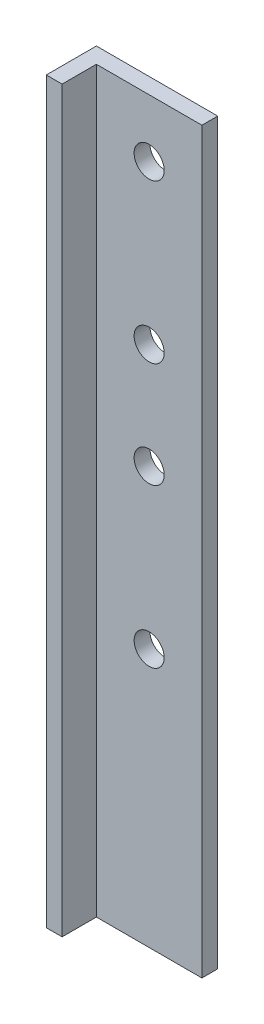
ISO-10303-21;
HEADER;
FILE_DESCRIPTION(('STEP AP214'),'2;1');
FILE_NAME('part.step','',(''),(''),'','','');
FILE_SCHEMA(('AUTOMOTIVE_DESIGN { 1 0 10303 214 1 1 1 1 }'));
ENDSEC;
DATA;
#1=APPLICATION_CONTEXT('core data for automotive mechanical design processes');
#2=APPLICATION_PROTOCOL_DEFINITION('international standard','automotive_design',2000,#1);
#3=PRODUCT_CONTEXT('',#1,'mechanical');
#4=PRODUCT('Part','Part','',(#3));
#5=PRODUCT_RELATED_PRODUCT_CATEGORY('part','',(#4));
#6=PRODUCT_DEFINITION_FORMATION('','',#4);
#7=PRODUCT_DEFINITION_CONTEXT('part definition',#1,'design');
#8=PRODUCT_DEFINITION('design','',#6,#7);
#9=PRODUCT_DEFINITION_SHAPE('','',#8);
#10=(LENGTH_UNIT() NAMED_UNIT(*) SI_UNIT(.MILLI.,.METRE.));
#11=(NAMED_UNIT(*) PLANE_ANGLE_UNIT() SI_UNIT($,.RADIAN.));
#12=(NAMED_UNIT(*) SI_UNIT($,.STERADIAN.) SOLID_ANGLE_UNIT());
#13=UNCERTAINTY_MEASURE_WITH_UNIT(LENGTH_MEASURE(1.E-05),#10,'distance_accuracy_value','');
#14=(GEOMETRIC_REPRESENTATION_CONTEXT(3) GLOBAL_UNCERTAINTY_ASSIGNED_CONTEXT((#13)) GLOBAL_UNIT_ASSIGNED_CONTEXT((#10,
#11,#12)) REPRESENTATION_CONTEXT('',''));
#15=CARTESIAN_POINT('',(0.,0.,0.));
#16=DIRECTION('',(0.,0.,1.));
#17=DIRECTION('',(1.,0.,0.));
#18=AXIS2_PLACEMENT_3D('',#15,#16,#17);
#19=CARTESIAN_POINT('',(0.,0.,0.));
#20=DIRECTION('',(0.,0.,-1.));
#21=DIRECTION('',(-1.,0.,0.));
#22=AXIS2_PLACEMENT_3D('',#19,#20,#21);
#23=PLANE('',#22);
#24=CARTESIAN_POINT('',(1.5,29.,0.));
#25=DIRECTION('',(0.,0.,1.));
#26=DIRECTION('',(1.,0.,0.));
#27=AXIS2_PLACEMENT_3D('',#24,#25,#26);
#28=CIRCLE('',#27,2.85);
#29=CARTESIAN_POINT('',(4.35,29.,0.));
#30=VERTEX_POINT('',#29);
#31=EDGE_CURVE('E150',#30,#30,#28,.T.);
#32=ORIENTED_EDGE('',*,*,#31,.F.);
#33=EDGE_LOOP('',(#32));
#34=FACE_BOUND('',#33,.T.);
#35=CARTESIAN_POINT('',(1.50000000000001,9.,0.));
#36=DIRECTION('',(0.,0.,1.));
#37=DIRECTION('',(1.,0.,0.));
#38=AXIS2_PLACEMENT_3D('',#35,#36,#37);
#39=CIRCLE('',#38,2.85);
#40=CARTESIAN_POINT('',(4.35,9.,0.));
#41=VERTEX_POINT('',#40);
#42=EDGE_CURVE('E209',#41,#41,#39,.T.);
#43=ORIENTED_EDGE('',*,*,#42,.F.);
#44=EDGE_LOOP('',(#43));
#45=FACE_BOUND('',#44,.T.);
#46=CARTESIAN_POINT('',(1.50000000000001,-21.,0.));
#47=DIRECTION('',(0.,0.,1.));
#48=DIRECTION('',(1.,0.,0.));
#49=AXIS2_PLACEMENT_3D('',#46,#47,#48);
#50=CIRCLE('',#49,2.85);
#51=CARTESIAN_POINT('',(4.35000000000001,-21.,0.));
#52=VERTEX_POINT('',#51);
#53=EDGE_CURVE('E212',#52,#52,#50,.T.);
#54=ORIENTED_EDGE('',*,*,#53,.F.);
#55=EDGE_LOOP('',(#54));
#56=FACE_BOUND('',#55,.T.);
#57=CARTESIAN_POINT('',(1.5,59.,0.));
#58=DIRECTION('',(0.,0.,1.));
#59=DIRECTION('',(1.,0.,0.));
#60=AXIS2_PLACEMENT_3D('',#57,#58,#59);
#61=CIRCLE('',#60,2.85);
#62=CARTESIAN_POINT('',(4.35,59.,0.));
#63=VERTEX_POINT('',#62);
#64=EDGE_CURVE('E122',#63,#63,#61,.T.);
#65=ORIENTED_EDGE('',*,*,#64,.F.);
#66=EDGE_LOOP('',(#65));
#67=FACE_BOUND('',#66,.T.);
#68=DIRECTION('',(0.,1.,0.));
#69=VECTOR('',#68,1.);
#70=CARTESIAN_POINT('',(-8.5,70.,0.));
#71=LINE('',#70,#69);
#72=CARTESIAN_POINT('',(-8.49999999999999,-70.,0.));
#73=VERTEX_POINT('',#72);
#74=CARTESIAN_POINT('',(-8.5,70.,0.));
#75=VERTEX_POINT('',#74);
#76=EDGE_CURVE('E49',#73,#75,#71,.T.);
#77=ORIENTED_EDGE('',*,*,#76,.F.);
#78=DIRECTION('',(1.,0.,0.));
#79=VECTOR('',#78,1.);
#80=CARTESIAN_POINT('',(-11.5,-70.,0.));
#81=LINE('',#80,#79);
#82=CARTESIAN_POINT('',(11.5,-70.,0.));
#83=VERTEX_POINT('',#82);
#84=EDGE_CURVE('E69',#73,#83,#81,.T.);
#85=ORIENTED_EDGE('',*,*,#84,.T.);
#86=DIRECTION('',(0.,1.,0.));
#87=VECTOR('',#86,1.);
#88=CARTESIAN_POINT('',(11.5,-70.,0.));
#89=LINE('',#88,#87);
#90=CARTESIAN_POINT('',(11.5,70.,0.));
#91=VERTEX_POINT('',#90);
#92=EDGE_CURVE('E131',#83,#91,#89,.T.);
#93=ORIENTED_EDGE('',*,*,#92,.T.);
#94=DIRECTION('',(-1.,0.,0.));
#95=VECTOR('',#94,1.);
#96=CARTESIAN_POINT('',(-11.5,70.,0.));
#97=LINE('',#96,#95);
#98=EDGE_CURVE('E140',#91,#75,#97,.T.);
#99=ORIENTED_EDGE('',*,*,#98,.T.);
#100=EDGE_LOOP('',(#77,#85,#93,#99));
#101=FACE_BOUND('',#100,.T.);
#102=ADVANCED_FACE('F32',(#34,#45,#56,#67,#101),#23,.F.);
#103=CARTESIAN_POINT('',(11.5,-70.,-3.));
#104=DIRECTION('',(1.,0.,0.));
#105=DIRECTION('',(0.,0.,-1.));
#106=AXIS2_PLACEMENT_3D('',#103,#104,#105);
#107=PLANE('',#106);
#108=ORIENTED_EDGE('',*,*,#92,.F.);
#109=DIRECTION('',(0.,0.,1.));
#110=VECTOR('',#109,1.);
#111=CARTESIAN_POINT('',(11.5,-70.,-3.));
#112=LINE('',#111,#110);
#113=CARTESIAN_POINT('',(11.5,-70.,-3.));
#114=VERTEX_POINT('',#113);
#115=EDGE_CURVE('E11',#114,#83,#112,.T.);
#116=ORIENTED_EDGE('',*,*,#115,.F.);
#117=DIRECTION('',(0.,1.,0.));
#118=VECTOR('',#117,1.);
#119=CARTESIAN_POINT('',(11.5,-70.,-3.));
#120=LINE('',#119,#118);
#121=CARTESIAN_POINT('',(11.5,70.,-3.));
#122=VERTEX_POINT('',#121);
#123=EDGE_CURVE('E132',#114,#122,#120,.T.);
#124=ORIENTED_EDGE('',*,*,#123,.T.);
#125=DIRECTION('',(0.,0.,1.));
#126=VECTOR('',#125,1.);
#127=CARTESIAN_POINT('',(11.5,70.,-3.));
#128=LINE('',#127,#126);
#129=EDGE_CURVE('E75',#122,#91,#128,.T.);
#130=ORIENTED_EDGE('',*,*,#129,.T.);
#131=EDGE_LOOP('',(#108,#116,#124,#130));
#132=FACE_BOUND('',#131,.T.);
#133=ADVANCED_FACE('F34',(#132),#107,.T.);
#134=CARTESIAN_POINT('',(-11.5,-70.,-3.));
#135=DIRECTION('',(0.,-1.,0.));
#136=DIRECTION('',(0.,0.,-1.));
#137=AXIS2_PLACEMENT_3D('',#134,#135,#136);
#138=PLANE('',#137);
#139=ORIENTED_EDGE('',*,*,#84,.F.);
#140=DIRECTION('',(0.,0.,-1.));
#141=VECTOR('',#140,1.);
#142=CARTESIAN_POINT('',(-8.49999999999998,-70.,6.5));
#143=LINE('',#142,#141);
#144=CARTESIAN_POINT('',(-8.49999999999998,-70.,6.5));
#145=VERTEX_POINT('',#144);
#146=EDGE_CURVE('E109',#145,#73,#143,.T.);
#147=ORIENTED_EDGE('',*,*,#146,.F.);
#148=DIRECTION('',(1.,0.,0.));
#149=VECTOR('',#148,1.);
#150=CARTESIAN_POINT('',(-11.5,-70.,6.5));
#151=LINE('',#150,#149);
#152=CARTESIAN_POINT('',(-11.5,-70.,6.5));
#153=VERTEX_POINT('',#152);
#154=EDGE_CURVE('E106',#153,#145,#151,.T.);
#155=ORIENTED_EDGE('',*,*,#154,.F.);
#156=DIRECTION('',(0.,0.,1.));
#157=VECTOR('',#156,1.);
#158=CARTESIAN_POINT('',(-11.5,-70.,-3.));
#159=LINE('',#158,#157);
#160=CARTESIAN_POINT('',(-11.5,-70.,-3.));
#161=VERTEX_POINT('',#160);
#162=EDGE_CURVE('E41',#161,#153,#159,.T.);
#163=ORIENTED_EDGE('',*,*,#162,.F.);
#164=DIRECTION('',(1.,0.,0.));
#165=VECTOR('',#164,1.);
#166=CARTESIAN_POINT('',(-11.5,-70.,-3.));
#167=LINE('',#166,#165);
#168=EDGE_CURVE('E137',#161,#114,#167,.T.);
#169=ORIENTED_EDGE('',*,*,#168,.T.);
#170=ORIENTED_EDGE('',*,*,#115,.T.);
#171=EDGE_LOOP('',(#139,#147,#155,#163,#169,#170));
#172=FACE_BOUND('',#171,.T.);
#173=ADVANCED_FACE('F107',(#172),#138,.T.);
#174=CARTESIAN_POINT('',(-11.5,-70.,-3.));
#175=DIRECTION('',(-1.,0.,0.));
#176=DIRECTION('',(0.,0.,1.));
#177=AXIS2_PLACEMENT_3D('',#174,#175,#176);
#178=PLANE('',#177);
#179=ORIENTED_EDGE('',*,*,#162,.T.);
#180=DIRECTION('',(0.,-1.,0.));
#181=VECTOR('',#180,1.);
#182=CARTESIAN_POINT('',(-11.5,70.,6.5));
#183=LINE('',#182,#181);
#184=CARTESIAN_POINT('',(-11.5,70.,6.5));
#185=VERTEX_POINT('',#184);
#186=EDGE_CURVE('E97',#185,#153,#183,.T.);
#187=ORIENTED_EDGE('',*,*,#186,.F.);
#188=DIRECTION('',(0.,0.,1.));
#189=VECTOR('',#188,1.);
#190=CARTESIAN_POINT('',(-11.5,70.,-3.));
#191=LINE('',#190,#189);
#192=CARTESIAN_POINT('',(-11.5,70.,-3.));
#193=VERTEX_POINT('',#192);
#194=EDGE_CURVE('E103',#193,#185,#191,.T.);
#195=ORIENTED_EDGE('',*,*,#194,.F.);
#196=DIRECTION('',(0.,-1.,0.));
#197=VECTOR('',#196,1.);
#198=CARTESIAN_POINT('',(-11.5,-70.,-3.));
#199=LINE('',#198,#197);
#200=EDGE_CURVE('E99',#193,#161,#199,.T.);
#201=ORIENTED_EDGE('',*,*,#200,.T.);
#202=EDGE_LOOP('',(#179,#187,#195,#201));
#203=FACE_BOUND('',#202,.T.);
#204=ADVANCED_FACE('F95',(#203),#178,.T.);
#205=CARTESIAN_POINT('',(-11.5,70.,-3.));
#206=DIRECTION('',(0.,1.,0.));
#207=DIRECTION('',(0.,0.,1.));
#208=AXIS2_PLACEMENT_3D('',#205,#206,#207);
#209=PLANE('',#208);
#210=ORIENTED_EDGE('',*,*,#98,.F.);
#211=ORIENTED_EDGE('',*,*,#129,.F.);
#212=DIRECTION('',(-1.,0.,0.));
#213=VECTOR('',#212,1.);
#214=CARTESIAN_POINT('',(-11.5,70.,-3.));
#215=LINE('',#214,#213);
#216=EDGE_CURVE('E134',#122,#193,#215,.T.);
#217=ORIENTED_EDGE('',*,*,#216,.T.);
#218=ORIENTED_EDGE('',*,*,#194,.T.);
#219=DIRECTION('',(-1.,0.,0.));
#220=VECTOR('',#219,1.);
#221=CARTESIAN_POINT('',(-11.5,70.,6.5));
#222=LINE('',#221,#220);
#223=CARTESIAN_POINT('',(-8.5,70.,6.5));
#224=VERTEX_POINT('',#223);
#225=EDGE_CURVE('E117',#224,#185,#222,.T.);
#226=ORIENTED_EDGE('',*,*,#225,.F.);
#227=DIRECTION('',(0.,0.,-1.));
#228=VECTOR('',#227,1.);
#229=CARTESIAN_POINT('',(-8.5,70.,6.5));
#230=LINE('',#229,#228);
#231=EDGE_CURVE('E126',#224,#75,#230,.T.);
#232=ORIENTED_EDGE('',*,*,#231,.T.);
#233=EDGE_LOOP('',(#210,#211,#217,#218,#226,#232));
#234=FACE_BOUND('',#233,.T.);
#235=ADVANCED_FACE('F177',(#234),#209,.T.);
#236=CARTESIAN_POINT('',(0.,0.,-3.));
#237=DIRECTION('',(0.,0.,-1.));
#238=DIRECTION('',(-1.,0.,0.));
#239=AXIS2_PLACEMENT_3D('',#236,#237,#238);
#240=PLANE('',#239);
#241=CARTESIAN_POINT('',(1.5,29.,-3.));
#242=DIRECTION('',(0.,0.,-1.));
#243=DIRECTION('',(-1.,0.,0.));
#244=AXIS2_PLACEMENT_3D('',#241,#242,#243);
#245=CIRCLE('',#244,2.85);
#246=CARTESIAN_POINT('',(-1.34999999999999,29.,-3.));
#247=VERTEX_POINT('',#246);
#248=EDGE_CURVE('E36',#247,#247,#245,.T.);
#249=ORIENTED_EDGE('',*,*,#248,.F.);
#250=EDGE_LOOP('',(#249));
#251=FACE_BOUND('',#250,.T.);
#252=CARTESIAN_POINT('',(1.50000000000001,9.,-3.));
#253=DIRECTION('',(0.,0.,-1.));
#254=DIRECTION('',(-1.,0.,0.));
#255=AXIS2_PLACEMENT_3D('',#252,#253,#254);
#256=CIRCLE('',#255,2.85);
#257=CARTESIAN_POINT('',(-1.34999999999999,9.,-3.));
#258=VERTEX_POINT('',#257);
#259=EDGE_CURVE('E149',#258,#258,#256,.T.);
#260=ORIENTED_EDGE('',*,*,#259,.F.);
#261=EDGE_LOOP('',(#260));
#262=FACE_BOUND('',#261,.T.);
#263=CARTESIAN_POINT('',(1.50000000000001,-21.,-3.));
#264=DIRECTION('',(0.,0.,-1.));
#265=DIRECTION('',(-1.,0.,0.));
#266=AXIS2_PLACEMENT_3D('',#263,#264,#265);
#267=CIRCLE('',#266,2.85);
#268=CARTESIAN_POINT('',(-1.34999999999999,-21.,-3.));
#269=VERTEX_POINT('',#268);
#270=EDGE_CURVE('E147',#269,#269,#267,.T.);
#271=ORIENTED_EDGE('',*,*,#270,.F.);
#272=EDGE_LOOP('',(#271));
#273=FACE_BOUND('',#272,.T.);
#274=CARTESIAN_POINT('',(1.5,59.,-3.));
#275=DIRECTION('',(0.,0.,-1.));
#276=DIRECTION('',(-1.,0.,0.));
#277=AXIS2_PLACEMENT_3D('',#274,#275,#276);
#278=CIRCLE('',#277,2.85);
#279=CARTESIAN_POINT('',(-1.35,59.,-3.));
#280=VERTEX_POINT('',#279);
#281=EDGE_CURVE('E119',#280,#280,#278,.T.);
#282=ORIENTED_EDGE('',*,*,#281,.F.);
#283=EDGE_LOOP('',(#282));
#284=FACE_BOUND('',#283,.T.);
#285=ORIENTED_EDGE('',*,*,#123,.F.);
#286=ORIENTED_EDGE('',*,*,#168,.F.);
#287=ORIENTED_EDGE('',*,*,#200,.F.);
#288=ORIENTED_EDGE('',*,*,#216,.F.);
#289=EDGE_LOOP('',(#285,#286,#287,#288));
#290=FACE_BOUND('',#289,.T.);
#291=ADVANCED_FACE('F172',(#251,#262,#273,#284,#290),#240,.T.);
#292=CARTESIAN_POINT('',(-8.5,70.,6.5));
#293=DIRECTION('',(-1.,0.,0.));
#294=DIRECTION('',(0.,-1.,0.));
#295=AXIS2_PLACEMENT_3D('',#292,#293,#294);
#296=PLANE('',#295);
#297=ORIENTED_EDGE('',*,*,#76,.T.);
#298=ORIENTED_EDGE('',*,*,#231,.F.);
#299=DIRECTION('',(0.,1.,0.));
#300=VECTOR('',#299,1.);
#301=CARTESIAN_POINT('',(-8.5,70.,6.5));
#302=LINE('',#301,#300);
#303=EDGE_CURVE('E112',#145,#224,#302,.T.);
#304=ORIENTED_EDGE('',*,*,#303,.F.);
#305=ORIENTED_EDGE('',*,*,#146,.T.);
#306=EDGE_LOOP('',(#297,#298,#304,#305));
#307=FACE_BOUND('',#306,.T.);
#308=ADVANCED_FACE('F182',(#307),#296,.F.);
#309=CARTESIAN_POINT('',(0.,0.,6.5));
#310=DIRECTION('',(0.,0.,1.));
#311=DIRECTION('',(1.,0.,0.));
#312=AXIS2_PLACEMENT_3D('',#309,#310,#311);
#313=PLANE('',#312);
#314=ORIENTED_EDGE('',*,*,#186,.T.);
#315=ORIENTED_EDGE('',*,*,#154,.T.);
#316=ORIENTED_EDGE('',*,*,#303,.T.);
#317=ORIENTED_EDGE('',*,*,#225,.T.);
#318=EDGE_LOOP('',(#314,#315,#316,#317));
#319=FACE_BOUND('',#318,.T.);
#320=ADVANCED_FACE('F115',(#319),#313,.T.);
#321=CARTESIAN_POINT('',(1.5,59.,-8.5));
#322=DIRECTION('',(0.,0.,1.));
#323=DIRECTION('',(1.,0.,0.));
#324=AXIS2_PLACEMENT_3D('',#321,#322,#323);
#325=CYLINDRICAL_SURFACE('',#324,2.85);
#326=ORIENTED_EDGE('',*,*,#281,.T.);
#327=EDGE_LOOP('',(#326));
#328=FACE_BOUND('',#327,.T.);
#329=ORIENTED_EDGE('',*,*,#64,.T.);
#330=EDGE_LOOP('',(#329));
#331=FACE_BOUND('',#330,.T.);
#332=ADVANCED_FACE('F160',(#328,#331),#325,.F.);
#333=CARTESIAN_POINT('',(1.50000000000001,-21.,-8.5));
#334=DIRECTION('',(0.,0.,1.));
#335=DIRECTION('',(1.,0.,0.));
#336=AXIS2_PLACEMENT_3D('',#333,#334,#335);
#337=CYLINDRICAL_SURFACE('',#336,2.85);
#338=ORIENTED_EDGE('',*,*,#270,.T.);
#339=EDGE_LOOP('',(#338));
#340=FACE_BOUND('',#339,.T.);
#341=ORIENTED_EDGE('',*,*,#53,.T.);
#342=EDGE_LOOP('',(#341));
#343=FACE_BOUND('',#342,.T.);
#344=ADVANCED_FACE('F195',(#340,#343),#337,.F.);
#345=CARTESIAN_POINT('',(1.50000000000001,9.,-8.5));
#346=DIRECTION('',(0.,0.,1.));
#347=DIRECTION('',(1.,0.,0.));
#348=AXIS2_PLACEMENT_3D('',#345,#346,#347);
#349=CYLINDRICAL_SURFACE('',#348,2.85);
#350=ORIENTED_EDGE('',*,*,#259,.T.);
#351=EDGE_LOOP('',(#350));
#352=FACE_BOUND('',#351,.T.);
#353=ORIENTED_EDGE('',*,*,#42,.T.);
#354=EDGE_LOOP('',(#353));
#355=FACE_BOUND('',#354,.T.);
#356=ADVANCED_FACE('F199',(#352,#355),#349,.F.);
#357=CARTESIAN_POINT('',(1.5,29.,-8.5));
#358=DIRECTION('',(0.,0.,1.));
#359=DIRECTION('',(1.,0.,0.));
#360=AXIS2_PLACEMENT_3D('',#357,#358,#359);
#361=CYLINDRICAL_SURFACE('',#360,2.85);
#362=ORIENTED_EDGE('',*,*,#248,.T.);
#363=EDGE_LOOP('',(#362));
#364=FACE_BOUND('',#363,.T.);
#365=ORIENTED_EDGE('',*,*,#31,.T.);
#366=EDGE_LOOP('',(#365));
#367=FACE_BOUND('',#366,.T.);
#368=ADVANCED_FACE('F203',(#364,#367),#361,.F.);
#369=CLOSED_SHELL('',(#102,#133,#173,#204,#235,#291,#308,#320,#332,#344,#356,#368));
#370=MANIFOLD_SOLID_BREP('B2',#369);
#371=ADVANCED_BREP_SHAPE_REPRESENTATION('',(#18,#370),#14);
#372=SHAPE_DEFINITION_REPRESENTATION(#9,#371);
ENDSEC;
END-ISO-10303-21;
